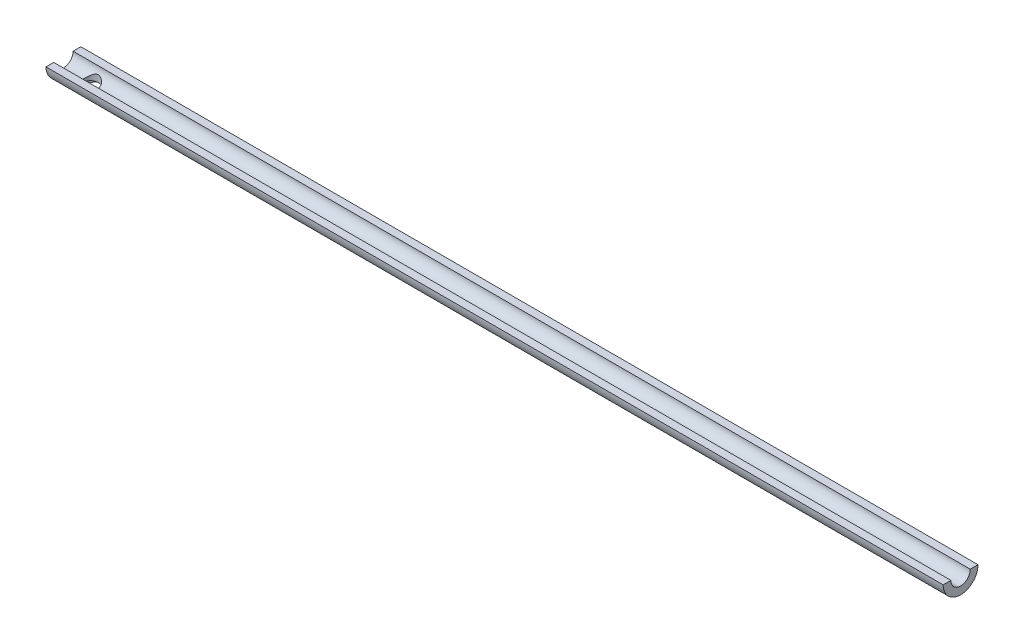
ISO-10303-21;
HEADER;
FILE_DESCRIPTION(('STEP AP214'),'2;1');
FILE_NAME('part.step','',(''),(''),'','','');
FILE_SCHEMA(('AUTOMOTIVE_DESIGN { 1 0 10303 214 1 1 1 1 }'));
ENDSEC;
DATA;
#1=APPLICATION_CONTEXT('core data for automotive mechanical design processes');
#2=APPLICATION_PROTOCOL_DEFINITION('international standard','automotive_design',2000,#1);
#3=PRODUCT_CONTEXT('',#1,'mechanical');
#4=PRODUCT('Part','Part','',(#3));
#5=PRODUCT_RELATED_PRODUCT_CATEGORY('part','',(#4));
#6=PRODUCT_DEFINITION_FORMATION('','',#4);
#7=PRODUCT_DEFINITION_CONTEXT('part definition',#1,'design');
#8=PRODUCT_DEFINITION('design','',#6,#7);
#9=PRODUCT_DEFINITION_SHAPE('','',#8);
#10=(LENGTH_UNIT() NAMED_UNIT(*) SI_UNIT(.MILLI.,.METRE.));
#11=(NAMED_UNIT(*) PLANE_ANGLE_UNIT() SI_UNIT($,.RADIAN.));
#12=(NAMED_UNIT(*) SI_UNIT($,.STERADIAN.) SOLID_ANGLE_UNIT());
#13=UNCERTAINTY_MEASURE_WITH_UNIT(LENGTH_MEASURE(1.E-05),#10,'distance_accuracy_value','');
#14=(GEOMETRIC_REPRESENTATION_CONTEXT(3) GLOBAL_UNCERTAINTY_ASSIGNED_CONTEXT((#13)) GLOBAL_UNIT_ASSIGNED_CONTEXT((#10,
#11,#12)) REPRESENTATION_CONTEXT('',''));
#15=CARTESIAN_POINT('',(0.,0.,0.));
#16=DIRECTION('',(0.,0.,1.));
#17=DIRECTION('',(1.,0.,0.));
#18=AXIS2_PLACEMENT_3D('',#15,#16,#17);
#19=CARTESIAN_POINT('',(735.584,15.875,0.));
#20=DIRECTION('',(-1.,0.,0.));
#21=DIRECTION('',(0.,0.,1.));
#22=AXIS2_PLACEMENT_3D('',#19,#20,#21);
#23=PLANE('',#22);
#24=CARTESIAN_POINT('',(735.584,15.875,-19.05));
#25=DIRECTION('',(-1.,0.,0.));
#26=DIRECTION('',(0.,0.,1.));
#27=AXIS2_PLACEMENT_3D('',#24,#25,#26);
#28=CIRCLE('',#27,14.2875);
#29=CARTESIAN_POINT('',(735.584,15.875,-33.3375));
#30=VERTEX_POINT('',#29);
#31=CARTESIAN_POINT('',(735.584,15.875,-4.7625));
#32=VERTEX_POINT('',#31);
#33=EDGE_CURVE('E65',#30,#32,#28,.T.);
#34=ORIENTED_EDGE('',*,*,#33,.F.);
#35=DIRECTION('',(0.,0.,-1.));
#36=VECTOR('',#35,1.);
#37=CARTESIAN_POINT('',(735.584,15.875,0.));
#38=LINE('',#37,#36);
#39=CARTESIAN_POINT('',(735.584,15.875,-26.9875));
#40=VERTEX_POINT('',#39);
#41=EDGE_CURVE('E105',#40,#30,#38,.T.);
#42=ORIENTED_EDGE('',*,*,#41,.F.);
#43=CARTESIAN_POINT('',(735.584,15.875,-19.05));
#44=DIRECTION('',(1.,0.,0.));
#45=DIRECTION('',(0.,0.,-1.));
#46=AXIS2_PLACEMENT_3D('',#43,#44,#45);
#47=CIRCLE('',#46,7.9375);
#48=CARTESIAN_POINT('',(735.584,15.875,-11.1125));
#49=VERTEX_POINT('',#48);
#50=EDGE_CURVE('E119',#49,#40,#47,.T.);
#51=ORIENTED_EDGE('',*,*,#50,.F.);
#52=EDGE_CURVE('E101',#32,#49,#38,.T.);
#53=ORIENTED_EDGE('',*,*,#52,.F.);
#54=EDGE_LOOP('',(#34,#42,#51,#53));
#55=FACE_BOUND('',#54,.T.);
#56=ADVANCED_FACE('F37',(#55),#23,.F.);
#57=CARTESIAN_POINT('',(0.,15.875,0.));
#58=DIRECTION('',(0.,-1.,0.));
#59=DIRECTION('',(0.,0.,-1.));
#60=AXIS2_PLACEMENT_3D('',#57,#58,#59);
#61=PLANE('',#60);
#62=DIRECTION('',(-1.,0.,0.));
#63=VECTOR('',#62,1.);
#64=CARTESIAN_POINT('',(735.584,15.875,-33.3375));
#65=LINE('',#64,#63);
#66=CARTESIAN_POINT('',(0.,15.875,-33.3375));
#67=VERTEX_POINT('',#66);
#68=EDGE_CURVE('E88',#67,#30,#65,.F.);
#69=ORIENTED_EDGE('',*,*,#68,.F.);
#70=DIRECTION('',(0.,0.,1.));
#71=VECTOR('',#70,1.);
#72=CARTESIAN_POINT('',(0.,15.875,0.));
#73=LINE('',#72,#71);
#74=CARTESIAN_POINT('',(0.,15.875,-26.9875));
#75=VERTEX_POINT('',#74);
#76=EDGE_CURVE('E106',#67,#75,#73,.T.);
#77=ORIENTED_EDGE('',*,*,#76,.T.);
#78=DIRECTION('',(1.,0.,0.));
#79=VECTOR('',#78,1.);
#80=CARTESIAN_POINT('',(0.,15.875,-26.9875));
#81=LINE('',#80,#79);
#82=EDGE_CURVE('E12',#75,#40,#81,.T.);
#83=ORIENTED_EDGE('',*,*,#82,.T.);
#84=ORIENTED_EDGE('',*,*,#41,.T.);
#85=EDGE_LOOP('',(#69,#77,#83,#84));
#86=FACE_BOUND('',#85,.T.);
#87=ADVANCED_FACE('F102',(#86),#61,.F.);
#88=DIRECTION('',(-1.,0.,0.));
#89=VECTOR('',#88,1.);
#90=CARTESIAN_POINT('',(735.584,15.875,-4.7625));
#91=LINE('',#90,#89);
#92=CARTESIAN_POINT('',(0.,15.875,-4.7625));
#93=VERTEX_POINT('',#92);
#94=EDGE_CURVE('E98',#32,#93,#91,.T.);
#95=ORIENTED_EDGE('',*,*,#94,.F.);
#96=ORIENTED_EDGE('',*,*,#52,.T.);
#97=DIRECTION('',(1.,0.,0.));
#98=VECTOR('',#97,1.);
#99=CARTESIAN_POINT('',(0.,15.875,-11.1125));
#100=LINE('',#99,#98);
#101=CARTESIAN_POINT('',(0.,15.875,-11.1125));
#102=VERTEX_POINT('',#101);
#103=EDGE_CURVE('E53',#49,#102,#100,.F.);
#104=ORIENTED_EDGE('',*,*,#103,.T.);
#105=EDGE_CURVE('E108',#102,#93,#73,.T.);
#106=ORIENTED_EDGE('',*,*,#105,.T.);
#107=EDGE_LOOP('',(#95,#96,#104,#106));
#108=FACE_BOUND('',#107,.T.);
#109=ADVANCED_FACE('F133',(#108),#61,.F.);
#110=CARTESIAN_POINT('',(22.225,5.5499,-19.05));
#111=DIRECTION('',(0.,-1.,0.));
#112=DIRECTION('',(0.,0.,-1.));
#113=AXIS2_PLACEMENT_3D('',#110,#111,#112);
#114=CYLINDRICAL_SURFACE('',#113,8.128);
#115=CARTESIAN_POINT('',(22.225,5.5499,-19.05));
#116=DIRECTION('',(0.,-1.,0.));
#117=DIRECTION('',(0.,0.,-1.));
#118=AXIS2_PLACEMENT_3D('',#115,#116,#117);
#119=CIRCLE('',#118,8.128);
#120=CARTESIAN_POINT('',(22.225,5.5499,-27.178));
#121=VERTEX_POINT('',#120);
#122=EDGE_CURVE('E94',#121,#121,#119,.T.);
#123=ORIENTED_EDGE('',*,*,#122,.F.);
#124=EDGE_LOOP('',(#123));
#125=FACE_BOUND('',#124,.T.);
#126=CARTESIAN_POINT('',(22.225,4.12475437490772,-27.178));
#127=CARTESIAN_POINT('',(22.0180147532059,4.1247532803757,-27.1779992237774));
#128=CARTESIAN_POINT('',(21.8110182894372,4.11926483692695,-27.1700813911082));
#129=CARTESIAN_POINT('',(21.3987922198779,4.09754245588704,-27.1385418085654));
#130=CARTESIAN_POINT('',(21.1935627571081,4.08130765661839,-27.1149187993993));
#131=CARTESIAN_POINT('',(20.7863878615931,4.03874877782049,-27.0523271400779));
#132=CARTESIAN_POINT('',(20.5844447959058,4.01241773491488,-27.0133478982228));
#133=CARTESIAN_POINT('',(20.1853282556612,3.95067075075943,-26.920586092574));
#134=CARTESIAN_POINT('',(19.988157024114,3.91525062456957,-26.8667967088247));
#135=CARTESIAN_POINT('',(19.6012008031054,3.83685509724765,-26.745511165725));
#136=CARTESIAN_POINT('',(19.4113740403267,3.79393385173565,-26.6781127509178));
#137=CARTESIAN_POINT('',(19.0385167877705,3.7016974888775,-26.5300382259267));
#138=CARTESIAN_POINT('',(18.8554888516306,3.6523799997255,-26.4493571873782));
#139=CARTESIAN_POINT('',(18.4970035159903,3.54873604210493,-26.2753794395942));
#140=CARTESIAN_POINT('',(18.3215461204565,3.49440957101198,-26.1820827237488));
#141=CARTESIAN_POINT('',(17.9788353795059,3.38212322601149,-25.9835226420731));
#142=CARTESIAN_POINT('',(17.8115823141774,3.32416322821229,-25.8782588681046));
#143=CARTESIAN_POINT('',(17.2873582640215,3.13391765196363,-25.5210848460265));
#144=CARTESIAN_POINT('',(16.946984312011,2.99695023811273,-25.2464934731679));
#145=CARTESIAN_POINT('',(16.472669066792,2.79305720220681,-24.7965425661813));
#146=CARTESIAN_POINT('',(16.3205174293569,2.72530880154062,-24.6401003216129));
#147=CARTESIAN_POINT('',(16.0288266458558,2.59177681487287,-24.3149290275969));
#148=CARTESIAN_POINT('',(15.8892896853653,2.52599357066447,-24.1461978581212));
#149=CARTESIAN_POINT('',(15.6112113719546,2.39188965528202,-23.7807265060997));
#150=CARTESIAN_POINT('',(15.4740014746693,2.32391350337649,-23.5828450606214));
#151=CARTESIAN_POINT('',(15.2169626423935,2.19404365322446,-23.1743177307861));
#152=CARTESIAN_POINT('',(15.0971260526265,2.13214728009375,-22.963677526368));
#153=CARTESIAN_POINT('',(14.8760572788859,2.01619860561373,-22.5308687873104));
#154=CARTESIAN_POINT('',(14.7748183059184,1.96214344338009,-22.3087044976281));
#155=CARTESIAN_POINT('',(14.592178921927,1.86349332974293,-21.8543445193544));
#156=CARTESIAN_POINT('',(14.5107756478608,1.81889701319039,-21.6221502841663));
#157=CARTESIAN_POINT('',(14.375223971502,1.74402848766091,-21.170385845118));
#158=CARTESIAN_POINT('',(14.3193106352917,1.71284266792939,-20.9514960729174));
#159=CARTESIAN_POINT('',(14.2257583035214,1.66040767567717,-20.5086681999183));
#160=CARTESIAN_POINT('',(14.1881183305758,1.63915797170662,-20.2847303697953));
#161=CARTESIAN_POINT('',(14.1317025233993,1.60723228622229,-19.8338970737274));
#162=CARTESIAN_POINT('',(14.1129137486965,1.59654905138997,-19.6070037451223));
#163=CARTESIAN_POINT('',(14.0944574588793,1.58605556350154,-19.152197221018));
#164=CARTESIAN_POINT('',(14.0947882780549,1.58624436326758,-18.9242841160921));
#165=CARTESIAN_POINT('',(14.1134480106352,1.59685216207865,-18.4950597861182));
#166=CARTESIAN_POINT('',(14.1297567730494,1.60612288849519,-18.2936283829412));
#167=CARTESIAN_POINT('',(14.1772302026522,1.63300272114614,-17.8930847861401));
#168=CARTESIAN_POINT('',(14.2083948904262,1.6506118389348,-17.6939725957299));
#169=CARTESIAN_POINT('',(14.285205100033,1.6937586086349,-17.2994481376163));
#170=CARTESIAN_POINT('',(14.330850422873,1.71929615159389,-17.1040358191084));
#171=CARTESIAN_POINT('',(14.4361090438978,1.77772437070963,-16.7181404779157));
#172=CARTESIAN_POINT('',(14.4957228984782,1.81061533976627,-16.5276576519185));
#173=CARTESIAN_POINT('',(14.6289037163109,1.883366444814,-16.151044574491));
#174=CARTESIAN_POINT('',(14.7025895729946,1.92328572021973,-15.9649678088723));
#175=CARTESIAN_POINT('',(14.8628859216692,2.00905516258062,-15.5998607105857));
#176=CARTESIAN_POINT('',(14.9495007436819,2.05490731581992,-15.420832764111));
#177=CARTESIAN_POINT('',(15.2276890928379,2.20000547802107,-14.8956302559676));
#178=CARTESIAN_POINT('',(15.4376919804277,2.30684115966405,-14.5610979019035));
#179=CARTESIAN_POINT('',(15.9273094610793,2.54539424455193,-13.8930550781077));
#180=CARTESIAN_POINT('',(16.2120962339968,2.67855865345796,-13.5638891046657));
#181=CARTESIAN_POINT('',(16.8300430009505,2.94841747384691,-12.9551675557189));
#182=CARTESIAN_POINT('',(17.1632609297996,3.08511594956813,-12.6756723006394));
#183=CARTESIAN_POINT('',(17.7123785400368,3.28931712151679,-12.285552451061));
#184=CARTESIAN_POINT('',(17.9135239179696,3.3602555712769,-12.1555659656631));
#185=CARTESIAN_POINT('',(18.3279364553059,3.49690988125253,-11.9131328407156));
#186=CARTESIAN_POINT('',(18.5412052632069,3.56262502829579,-11.8006885943137));
#187=CARTESIAN_POINT('',(18.9784190779849,3.68628936956866,-11.5946376821911));
#188=CARTESIAN_POINT('',(19.2023480558645,3.74424975339225,-11.5010037743509));
#189=CARTESIAN_POINT('',(19.6597889977331,3.85006144936678,-11.3335671871596));
#190=CARTESIAN_POINT('',(19.8932976168246,3.89791625477487,-11.2597576525893));
#191=CARTESIAN_POINT('',(20.3141247550129,3.97176227899168,-11.147531505603));
#192=CARTESIAN_POINT('',(20.4998869661831,4.00025064127314,-11.1048837500096));
#193=CARTESIAN_POINT('',(20.8749901106291,4.04891667287766,-11.032624119537));
#194=CARTESIAN_POINT('',(21.0643303425699,4.06909595356551,-11.0030097170471));
#195=CARTESIAN_POINT('',(21.4452238519753,4.10043715333412,-10.9572193397773));
#196=CARTESIAN_POINT('',(21.6367752842204,4.11160610746744,-10.9410328804927));
#197=CARTESIAN_POINT('',(22.0208703931804,4.12454872876364,-10.922289176426));
#198=CARTESIAN_POINT('',(22.2134140953366,4.12632215381884,-10.9197322828558));
#199=CARTESIAN_POINT('',(22.5981461721252,4.12040541837536,-10.9282890627355));
#200=CARTESIAN_POINT('',(22.7903343200902,4.11271051065841,-10.9394095937503));
#201=CARTESIAN_POINT('',(23.1728480072731,4.08813218458613,-10.9751705709717));
#202=CARTESIAN_POINT('',(23.3631735398583,4.0712487335235,-10.9998110653035));
#203=CARTESIAN_POINT('',(23.7407450063913,4.02888080940674,-11.062288437456));
#204=CARTESIAN_POINT('',(23.9279896141035,4.00339272894072,-11.1001308502822));
#205=CARTESIAN_POINT('',(24.2982642769525,3.94464973717565,-11.1885617223697));
#206=CARTESIAN_POINT('',(24.4812926013519,3.91139169667847,-11.2391553175666));
#207=CARTESIAN_POINT('',(24.844494847235,3.83764193152166,-11.3532904310791));
#208=CARTESIAN_POINT('',(25.0246000490354,3.79706122163712,-11.4169927594608));
#209=CARTESIAN_POINT('',(25.3787080656639,3.71010547664289,-11.5563533307756));
#210=CARTESIAN_POINT('',(25.5527088431555,3.6637285301769,-11.6320155197594));
#211=CARTESIAN_POINT('',(26.0645284851636,3.51767962655346,-11.8760720749144));
#212=CARTESIAN_POINT('',(26.3923325093595,3.41105365305769,-12.061589808659));
#213=CARTESIAN_POINT('',(27.0686900250849,3.17013197155076,-12.508338747979));
#214=CARTESIAN_POINT('',(27.4117498844501,3.03417303350307,-12.7770107658701));
#215=CARTESIAN_POINT('',(27.8909516798366,2.83082797521136,-13.2183070688705));
#216=CARTESIAN_POINT('',(28.0448883261136,2.76309531190179,-13.3719150091513));
#217=CARTESIAN_POINT('',(28.3403524753679,2.6293049873683,-13.6914386250406));
#218=CARTESIAN_POINT('',(28.4818779387584,2.56324760271373,-13.8573563153278));
#219=CARTESIAN_POINT('',(28.7648784244889,2.42801685551445,-14.2176239858584));
#220=CARTESIAN_POINT('',(28.9049937562794,2.35917096368468,-14.4131675097714));
#221=CARTESIAN_POINT('',(29.1680510426809,2.22724240655099,-14.8172109410428));
#222=CARTESIAN_POINT('',(29.2910003725608,2.16415727022872,-15.0257052282056));
#223=CARTESIAN_POINT('',(29.5185153802836,2.04553079179035,-15.4544625311531));
#224=CARTESIAN_POINT('',(29.623087585257,1.9899867728441,-15.6747213320632));
#225=CARTESIAN_POINT('',(29.8126114017301,1.88808715215838,-16.1255674144062));
#226=CARTESIAN_POINT('',(29.8975657204929,1.84173028272008,-16.356153265459));
#227=CARTESIAN_POINT('',(30.0405319279167,1.76303511449334,-16.8065627144205));
#228=CARTESIAN_POINT('',(30.1001807373834,1.72985955165364,-17.0257206954869));
#229=CARTESIAN_POINT('',(30.2010980032451,1.6734276457378,-17.4694910599292));
#230=CARTESIAN_POINT('',(30.2423673439576,1.65017082542945,-17.694103180334));
#231=CARTESIAN_POINT('',(30.3058771817978,1.61427905051082,-18.1466803103593));
#232=CARTESIAN_POINT('',(30.328131386229,1.6016364446235,-18.3746427840472));
#233=CARTESIAN_POINT('',(30.3533008556728,1.58733273321917,-18.8319685103891));
#234=CARTESIAN_POINT('',(30.3562179535954,1.58567058689532,-19.0613316282171));
#235=CARTESIAN_POINT('',(30.3434555646966,1.59292805827617,-19.4929113254883));
#236=CARTESIAN_POINT('',(30.329877594262,1.6006519084853,-19.6952143027216));
#237=CARTESIAN_POINT('',(30.2877260874705,1.62454313495614,-20.0977497224463));
#238=CARTESIAN_POINT('',(30.259152613769,1.64071047593858,-20.2979821735855));
#239=CARTESIAN_POINT('',(30.1873597538179,1.6811081377679,-20.6949623606104));
#240=CARTESIAN_POINT('',(30.1441407301919,1.70533825898019,-20.8917101826484));
#241=CARTESIAN_POINT('',(30.0435525296171,1.76130836593261,-21.2804571592908));
#242=CARTESIAN_POINT('',(29.9861828292883,1.79304862944265,-21.4724561379644));
#243=CARTESIAN_POINT('',(29.8577103118146,1.86344616022037,-21.8511049285758));
#244=CARTESIAN_POINT('',(29.7865700609654,1.90212226021264,-22.0377385298514));
#245=CARTESIAN_POINT('',(29.6313250934355,1.9855200799614,-22.4041579276078));
#246=CARTESIAN_POINT('',(29.547216049953,2.03024381678706,-22.5839414136153));
#247=CARTESIAN_POINT('',(29.2764762262614,2.17215934525449,-23.1116732419864));
#248=CARTESIAN_POINT('',(29.0713476266087,2.27714337546833,-23.448251074376));
#249=CARTESIAN_POINT('',(28.5924271313372,2.51221039405393,-24.1204134915682));
#250=CARTESIAN_POINT('',(28.3135686743286,2.64378358838054,-24.4518300479086));
#251=CARTESIAN_POINT('',(27.7075374404192,2.91149202465902,-25.066008590855));
#252=CARTESIAN_POINT('',(27.380307034293,3.04763255637928,-25.3487116591085));
#253=CARTESIAN_POINT('',(26.8397096345114,3.25231241551686,-25.7452001411438));
#254=CARTESIAN_POINT('',(26.6410517451605,3.32379995190781,-25.8779005695173));
#255=CARTESIAN_POINT('',(26.2314938118909,3.46197839661398,-26.1259932134789));
#256=CARTESIAN_POINT('',(26.0205920153576,3.52866861515832,-26.2413829426684));
#257=CARTESIAN_POINT('',(25.5879373800307,3.65473552688157,-26.4535817018082));
#258=CARTESIAN_POINT('',(25.3662003977546,3.71412248496211,-26.5504169199846));
#259=CARTESIAN_POINT('',(24.9129075625092,3.82324468480013,-26.7245307380687));
#260=CARTESIAN_POINT('',(24.6813552048321,3.87298332775522,-26.801816232523));
#261=CARTESIAN_POINT('',(24.2671813550624,3.9499023117823,-26.9194578131634));
#262=CARTESIAN_POINT('',(24.0862738513112,3.97962899667628,-26.9642247084879));
#263=CARTESIAN_POINT('',(23.7207562828793,4.03131583410353,-27.0413681658742));
#264=CARTESIAN_POINT('',(23.5361469383456,4.05327748203223,-27.073747113713));
#265=CARTESIAN_POINT('',(23.164458579354,4.08870874786635,-27.1257035236378));
#266=CARTESIAN_POINT('',(22.9773814513257,4.10218450749925,-27.1452902445796));
#267=CARTESIAN_POINT('',(22.6018727277906,4.1202082191966,-27.1714394195515));
#268=CARTESIAN_POINT('',(22.4134410124486,4.12475537137837,-27.1780007066792));
#269=CARTESIAN_POINT('',(22.225,4.12475437490772,-27.178));
#270=B_SPLINE_CURVE_WITH_KNOTS('',3,(#126,#127,#128,#129,#130,#131,#132,#133,#134,#135,#136,
#137,#138,#139,#140,#141,#142,#143,#144,#145,#146,#147,#148,#149,#150,#151,#152,#153,#154,#155,
#156,#157,#158,#159,#160,#161,#162,#163,#164,#165,#166,#167,#168,#169,#170,#171,#172,#173,#174,
#175,#176,#177,#178,#179,#180,#181,#182,#183,#184,#185,#186,#187,#188,#189,#190,#191,#192,#193,
#194,#195,#196,#197,#198,#199,#200,#201,#202,#203,#204,#205,#206,#207,#208,#209,#210,#211,#212,
#213,#214,#215,#216,#217,#218,#219,#220,#221,#222,#223,#224,#225,#226,#227,#228,#229,#230,#231,
#232,#233,#234,#235,#236,#237,#238,#239,#240,#241,#242,#243,#244,#245,#246,#247,#248,#249,#250,
#251,#252,#253,#254,#255,#256,#257,#258,#259,#260,#261,#262,#263,#264,#265,#266,#267,#268,#269),
.UNSPECIFIED.,.T.,.F.,(4,2,2,2,2,2,2,2,2,2,2,2,2,2,2,2,2,2,2,2,2,2,2,2,2,2,2,2,2,2,2,2,2,2,2,2,
2,2,2,2,2,2,2,2,2,2,2,2,2,2,2,2,2,2,2,2,2,2,2,2,2,2,2,2,2,2,2,2,2,2,2,4),(0.,0.620754127397335,
1.24155803489433,1.86279088308009,2.48431028401051,3.10151510056483,3.71894944213898,
4.33638410720971,4.95383983629194,6.32207699198678,7.0070909176564,7.69222329994257,
8.44188180863365,9.19120900314588,9.94026211248618,10.6892070409743,11.3724245891144,
12.0556055900344,12.7383172974124,13.4209695266473,14.0271565984417,14.6333445102122,
15.2395240921138,15.8457278235166,16.457300101753,17.069077662278,18.2918655983163,
19.6521467844397,21.0140687809612,21.7625974992275,22.5112282441642,23.2587668400916,
24.0060466052428,24.5835815681624,25.161004477988,25.737976111966,26.3149626135041,
26.8922385215696,27.4695164845053,28.0470367670997,28.624790036755,29.2101056428332,
29.7956147733005,30.9660989876605,32.329617069885,33.0123866851701,33.6952682936899,
34.4449625332793,35.1943336735009,35.943438114087,36.6924391166014,37.3800868041914,
38.0677014024412,38.7548199057505,39.4418732780968,40.0498584890229,40.6578411596363,
41.2658087777079,41.8737988855684,42.4834655652482,43.0933360910135,44.3122855860784,
45.6650948400749,47.0195289870142,47.7668485354288,48.5142753215082,49.2606392749048,
50.0067396420717,50.5723472476314,51.1378458687382,51.7029347339975,52.2680742212807),.UNSPECIFIED.);
#271=CARTESIAN_POINT('',(22.225,4.12475437490772,-27.178));
#272=VERTEX_POINT('',#271);
#273=EDGE_CURVE('E42',#272,#272,#270,.T.);
#274=ORIENTED_EDGE('',*,*,#273,.F.);
#275=EDGE_LOOP('',(#274));
#276=FACE_BOUND('',#275,.T.);
#277=ADVANCED_FACE('F129',(#125,#276),#114,.F.);
#278=CARTESIAN_POINT('',(22.225,15.875,-19.05));
#279=DIRECTION('',(0.,-1.,0.));
#280=DIRECTION('',(0.,0.,-1.));
#281=AXIS2_PLACEMENT_3D('',#278,#279,#280);
#282=CYLINDRICAL_SURFACE('',#281,6.35);
#283=CARTESIAN_POINT('',(22.225,11.1125,-25.4));
#284=CARTESIAN_POINT('',(22.1057591384843,11.1124972219549,-25.3999988458941));
#285=CARTESIAN_POINT('',(21.9864748221275,11.1079993597814,-25.3966322226424));
#286=CARTESIAN_POINT('',(21.7488907056395,11.0902297345786,-25.3832454421482));
#287=CARTESIAN_POINT('',(21.6305916325855,11.0769519886551,-25.373220747862));
#288=CARTESIAN_POINT('',(21.3956326538325,11.0422244649837,-25.3467183488856));
#289=CARTESIAN_POINT('',(21.2789776740302,11.0207540188557,-25.3302243205294));
#290=CARTESIAN_POINT('',(21.0482322748224,10.9705645850597,-25.2911079734667));
#291=CARTESIAN_POINT('',(20.9341436187361,10.9418407698869,-25.2684815726006));
#292=CARTESIAN_POINT('',(20.6698149950906,10.8671250091594,-25.2085803850203));
#293=CARTESIAN_POINT('',(20.5208230817188,10.8186030878779,-25.1689484172837));
#294=CARTESIAN_POINT('',(20.2289745443959,10.7129272316712,-25.0800639867922));
#295=CARTESIAN_POINT('',(20.0861181200141,10.6557730162358,-25.0308112113897));
#296=CARTESIAN_POINT('',(19.8062660642576,10.5349899459523,-24.9232234692227));
#297=CARTESIAN_POINT('',(19.669285792068,10.4713454366179,-24.8648663544885));
#298=CARTESIAN_POINT('',(19.4015035032551,10.3396631652094,-24.7396585029541));
#299=CARTESIAN_POINT('',(19.2707013299446,10.2716255146565,-24.67280798172));
#300=CARTESIAN_POINT('',(18.9689123311058,10.1076666116393,-24.5052741617836));
#301=CARTESIAN_POINT('',(18.8004994083019,10.0105595449506,-24.4010983926801));
#302=CARTESIAN_POINT('',(18.4747411758871,9.81455900031779,-24.1780631831489));
#303=CARTESIAN_POINT('',(18.3173998706645,9.71566489212355,-24.0591984724233));
#304=CARTESIAN_POINT('',(18.0141745830674,9.51896622305511,-23.8071297364857));
#305=CARTESIAN_POINT('',(17.8682815003554,9.42116085091244,-23.6739373044144));
#306=CARTESIAN_POINT('',(17.5884520150845,9.22905033185359,-23.3932895774403));
#307=CARTESIAN_POINT('',(17.4545116369805,9.13474402726844,-23.2458390591218));
#308=CARTESIAN_POINT('',(17.2247252749737,8.9699959351478,-22.9673449195798));
#309=CARTESIAN_POINT('',(17.1265784648234,8.8985179083313,-22.838807636718));
#310=CARTESIAN_POINT('',(16.9392996888609,8.76050584730411,-22.5728278495661));
#311=CARTESIAN_POINT('',(16.8501659790643,8.69397085730703,-22.435387076528));
#312=CARTESIAN_POINT('',(16.6818224419905,8.5671160758903,-22.1520641335981));
#313=CARTESIAN_POINT('',(16.6026009502199,8.50678899426989,-22.0061921867114));
#314=CARTESIAN_POINT('',(16.4548972991769,8.39347292260139,-21.7063744157807));
#315=CARTESIAN_POINT('',(16.3864133583647,8.34048271541368,-21.5524299367735));
#316=CARTESIAN_POINT('',(16.2712998867497,8.25090222497836,-21.2627288912534));
#317=CARTESIAN_POINT('',(16.2229271245307,8.21304556414684,-21.1280548308056));
#318=CARTESIAN_POINT('',(16.1350073540434,8.1439796234637,-20.8542062924032));
#319=CARTESIAN_POINT('',(16.0954586643362,8.11276907723781,-20.7150326776414));
#320=CARTESIAN_POINT('',(16.0257319046027,8.05759142155982,-20.4329925890225));
#321=CARTESIAN_POINT('',(15.9955506797095,8.03362187348591,-20.2901273760563));
#322=CARTESIAN_POINT('',(15.9449979075001,7.99340132029282,-20.0015900671859));
#323=CARTESIAN_POINT('',(15.9246264773177,7.97715040733795,-19.8559179377874));
#324=CARTESIAN_POINT('',(15.8939742252697,7.95267660979672,-19.5623202973743));
#325=CARTESIAN_POINT('',(15.8837290807651,7.94448211044445,-19.4143886706816));
#326=CARTESIAN_POINT('',(15.8736317234484,7.93640591835768,-19.1179425051374));
#327=CARTESIAN_POINT('',(15.8737795306279,7.93652424161364,-18.9694279651653));
#328=CARTESIAN_POINT('',(15.8844657647045,7.94507122345287,-18.6730105441203));
#329=CARTESIAN_POINT('',(15.8950045434275,7.95350016342383,-18.5251076839286));
#330=CARTESIAN_POINT('',(15.9262904810444,7.97847801465032,-18.2310877763495));
#331=CARTESIAN_POINT('',(15.9470374044877,7.99502673862313,-18.0849706878529));
#332=CARTESIAN_POINT('',(15.9969907893957,8.03476476708318,-17.8035288449841));
#333=CARTESIAN_POINT('',(16.0256710532915,8.05754022627937,-17.6680516176092));
#334=CARTESIAN_POINT('',(16.0914535840831,8.10960253530147,-17.400416540722));
#335=CARTESIAN_POINT('',(16.1285587103399,8.1388915957453,-17.2682598351326));
#336=CARTESIAN_POINT('',(16.2518278800462,8.23578674342528,-16.8778934421997));
#337=CARTESIAN_POINT('',(16.3499812030746,8.31244938670406,-16.6255922490497));
#338=CARTESIAN_POINT('',(16.5849425790291,8.49357006379646,-16.1177567955594));
#339=CARTESIAN_POINT('',(16.7245634348964,8.59999424128749,-15.8642523230182));
#340=CARTESIAN_POINT('',(17.0323997031645,8.82985693419508,-15.3838163607941));
#341=CARTESIAN_POINT('',(17.2006311227357,8.9533049668444,-15.1568998673721));
#342=CARTESIAN_POINT('',(17.599247533671,9.23757648369878,-14.6866782205678));
#343=CARTESIAN_POINT('',(17.8352964950782,9.40085954638908,-14.4496328536501));
#344=CARTESIAN_POINT('',(18.2134644245732,9.64885681800549,-14.1247852202108));
#345=CARTESIAN_POINT('',(18.3436715236388,9.73211536165979,-14.0215391926606));
#346=CARTESIAN_POINT('',(18.6120364616535,9.89806459791115,-13.8253838447953));
#347=CARTESIAN_POINT('',(18.750193345466,9.98075535739463,-13.7324732866306));
#348=CARTESIAN_POINT('',(19.0207172231311,10.1358559433147,-13.5656739544279));
#349=CARTESIAN_POINT('',(19.1523596374472,10.2084887250832,-13.4908149565788));
#350=CARTESIAN_POINT('',(19.4222204839244,10.3501671307733,-13.3499914110003));
#351=CARTESIAN_POINT('',(19.5604396658711,10.4192123438073,-13.284027880703));
#352=CARTESIAN_POINT('',(19.8433344682341,10.5516401770166,-13.1615478674818));
#353=CARTESIAN_POINT('',(19.9879986018397,10.6150323113207,-13.1050153669272));
#354=CARTESIAN_POINT('',(20.2838916089167,10.7338991642908,-13.0019283687376));
#355=CARTESIAN_POINT('',(20.4351174417561,10.7893775001025,-12.9553693076468));
#356=CARTESIAN_POINT('',(20.8050750302486,10.909488067719,-12.856790901728));
#357=CARTESIAN_POINT('',(21.0269350008432,10.9691190991629,-12.8098438723878));
#358=CARTESIAN_POINT('',(21.3664756142304,11.0370120991732,-12.7572595239636));
#359=CARTESIAN_POINT('',(21.4807187070347,11.0560464606787,-12.7427070978371));
#360=CARTESIAN_POINT('',(21.7108427999921,11.0861810382376,-12.7197958167764));
#361=CARTESIAN_POINT('',(21.8267229997876,11.0972850031914,-12.7114340352982));
#362=CARTESIAN_POINT('',(22.0599834113241,11.1110734118982,-12.7010642058163));
#363=CARTESIAN_POINT('',(22.1773684632081,11.1137058814102,-12.6990953791486));
#364=CARTESIAN_POINT('',(22.4119367053587,11.1102754878997,-12.701668656824));
#365=CARTESIAN_POINT('',(22.5291198988202,11.1042127637899,-12.7062106571513));
#366=CARTESIAN_POINT('',(22.7624286286122,11.0836834457076,-12.7217020603789));
#367=CARTESIAN_POINT('',(22.8785529846686,11.0692084186486,-12.7326578930387));
#368=CARTESIAN_POINT('',(23.1088555865426,11.0325145270898,-12.7607416573147));
#369=CARTESIAN_POINT('',(23.2230327388028,11.0102914523313,-12.777872944821));
#370=CARTESIAN_POINT('',(23.4774218722534,10.9525028875428,-12.823075168888));
#371=CARTESIAN_POINT('',(23.6168924813598,10.9149829450432,-12.8528186884582));
#372=CARTESIAN_POINT('',(23.891099520446,10.8311707927761,-12.9208402097144));
#373=CARTESIAN_POINT('',(24.0258319605229,10.7848713902393,-12.9591252137757));
#374=CARTESIAN_POINT('',(24.2904860170597,10.6853406939884,-13.0437021656338));
#375=CARTESIAN_POINT('',(24.4203954892771,10.632093249229,-13.0900128544685));
#376=CARTESIAN_POINT('',(24.6749685412999,10.5204998989995,-13.1900635829332));
#377=CARTESIAN_POINT('',(24.7996336408536,10.4621554858521,-13.2438014506513));
#378=CARTESIAN_POINT('',(25.0997979426272,10.31426122627,-13.384602120324));
#379=CARTESIAN_POINT('',(25.2724245021782,10.2226593973931,-13.4756543649093));
#380=CARTESIAN_POINT('',(25.6070500128911,10.035440516892,-13.6720921009435));
#381=CARTESIAN_POINT('',(25.7690445595234,9.93982182776937,-13.7774834778029));
#382=CARTESIAN_POINT('',(26.0825519969922,9.74745639829163,-14.0023242549401));
#383=CARTESIAN_POINT('',(26.2340543941688,9.6507086385288,-14.1217874155795));
#384=CARTESIAN_POINT('',(26.5260896306543,9.45871705837796,-14.3744890206292));
#385=CARTESIAN_POINT('',(26.6666241816978,9.36347300516712,-14.5077253079136));
#386=CARTESIAN_POINT('',(26.9380504997915,9.1754069890604,-14.7898921125293));
#387=CARTESIAN_POINT('',(27.0687750671124,9.08263935328997,-14.9390203072271));
#388=CARTESIAN_POINT('',(27.3172922119868,8.90323851781723,-15.2512030194205));
#389=CARTESIAN_POINT('',(27.4350827656831,8.81660627890547,-15.4142597093085));
#390=CARTESIAN_POINT('',(27.6560024910763,8.65199601724719,-15.753402670861));
#391=CARTESIAN_POINT('',(27.759171059199,8.57399486899366,-15.9294519094453));
#392=CARTESIAN_POINT('',(27.9495041145189,8.42868701323317,-16.2941347802323));
#393=CARTESIAN_POINT('',(28.0366776630869,8.36137425355324,-16.4827612042111));
#394=CARTESIAN_POINT('',(28.1679371759395,8.25930533821191,-16.8085411976495));
#395=CARTESIAN_POINT('',(28.2168523605264,8.22105056904939,-16.9426768003211));
#396=CARTESIAN_POINT('',(28.3059225755803,8.1511238480204,-17.2154828490856));
#397=CARTESIAN_POINT('',(28.3460798872378,8.11945018205531,-17.3541521034368));
#398=CARTESIAN_POINT('',(28.4170802762044,8.06329128564868,-17.6352069978433));
#399=CARTESIAN_POINT('',(28.4479282853632,8.03880224915142,-17.7775906265178));
#400=CARTESIAN_POINT('',(28.4998780705768,7.99748435424602,-18.0652349696616));
#401=CARTESIAN_POINT('',(28.5209795001576,7.98065576815389,-18.2104957862186));
#402=CARTESIAN_POINT('',(28.553150118331,7.9549750183341,-18.5033759159579));
#403=CARTESIAN_POINT('',(28.5641820064773,7.94615251209945,-18.6510019533693));
#404=CARTESIAN_POINT('',(28.575889915589,7.936788832081,-18.9469277200917));
#405=CARTESIAN_POINT('',(28.5765659776676,7.93624762542,-19.0952274467257));
#406=CARTESIAN_POINT('',(28.5675501276612,7.94345909763747,-19.3913166069886));
#407=CARTESIAN_POINT('',(28.5578575516261,7.95121230764449,-19.5391060073309));
#408=CARTESIAN_POINT('',(28.5282714716249,7.97483806869203,-19.8329959176992));
#409=CARTESIAN_POINT('',(28.5083781909919,7.99071044197257,-19.9790964646291));
#410=CARTESIAN_POINT('',(28.460054383025,8.02916627577007,-20.260741980603));
#411=CARTESIAN_POINT('',(28.4321409338752,8.05134258488209,-20.3964318663915));
#412=CARTESIAN_POINT('',(28.3678603290517,8.10224256435014,-20.6645593229208));
#413=CARTESIAN_POINT('',(28.3314902938922,8.13096846479139,-20.796995768837));
#414=CARTESIAN_POINT('',(28.2103691326562,8.22623984713279,-21.1882875515607));
#415=CARTESIAN_POINT('',(28.1135726801725,8.3019066317878,-21.4413202719508));
#416=CARTESIAN_POINT('',(27.8816507520017,8.48087040704626,-21.9500369931147));
#417=CARTESIAN_POINT('',(27.7437967431015,8.58608331614379,-22.2037766198138));
#418=CARTESIAN_POINT('',(27.4394933920737,8.8136852520537,-22.6849259779936));
#419=CARTESIAN_POINT('',(27.2730288675778,8.93608339198155,-22.912321622052));
#420=CARTESIAN_POINT('',(26.8785840116381,9.2181019376477,-23.3835303595262));
#421=CARTESIAN_POINT('',(26.6449864834486,9.38021324143599,-23.6211771689838));
#422=CARTESIAN_POINT('',(26.2706321701248,9.62681474290927,-23.947222545999));
#423=CARTESIAN_POINT('',(26.1417194950207,9.70966862244295,-24.0509181690198));
#424=CARTESIAN_POINT('',(25.8760048176365,9.87496758185915,-24.2480792684281));
#425=CARTESIAN_POINT('',(25.7392036904063,9.95741270598645,-24.3415458761787));
#426=CARTESIAN_POINT('',(25.4691438103369,10.1135120582993,-24.5108919386508));
#427=CARTESIAN_POINT('',(25.3364918615215,10.1873383601279,-24.5875822124682));
#428=CARTESIAN_POINT('',(25.0644541960524,10.3314825395802,-24.7318759305527));
#429=CARTESIAN_POINT('',(24.9250675822608,10.4017999472269,-24.7994781596216));
#430=CARTESIAN_POINT('',(24.6396291946371,10.5368288153116,-24.9250595507309));
#431=CARTESIAN_POINT('',(24.4935869070977,10.6015478956399,-24.983051894544));
#432=CARTESIAN_POINT('',(24.1947685264943,10.7230369171374,-25.0888461664442));
#433=CARTESIAN_POINT('',(24.0419958660816,10.7798108501993,-25.1366532182968));
#434=CARTESIAN_POINT('',(23.6660267534629,10.9035673752009,-25.2385053748773));
#435=CARTESIAN_POINT('',(23.4394748740142,10.9653000672875,-25.2871699237859));
#436=CARTESIAN_POINT('',(23.0927039816094,11.0354263127912,-25.3415251697116));
#437=CARTESIAN_POINT('',(22.9761072482384,11.0550456659685,-25.3565294604933));
#438=CARTESIAN_POINT('',(22.7411965863047,11.0860166213217,-25.3800816770978));
#439=CARTESIAN_POINT('',(22.6228839194248,11.0973740123245,-25.3886341236262));
#440=CARTESIAN_POINT('',(22.4577562239133,11.1070423223516,-25.3959036538931));
#441=CARTESIAN_POINT('',(22.4112474241326,11.1090866431282,-25.3974387855292));
#442=CARTESIAN_POINT('',(22.3181612990727,11.1118161130861,-25.3994872505401));
#443=CARTESIAN_POINT('',(22.2715839656612,11.1125010853021,-25.4000004508759));
#444=CARTESIAN_POINT('',(22.225,11.1125,-25.4));
#445=B_SPLINE_CURVE_WITH_KNOTS('',3,(#283,#284,#285,#286,#287,#288,#289,#290,#291,#292,#293,
#294,#295,#296,#297,#298,#299,#300,#301,#302,#303,#304,#305,#306,#307,#308,#309,#310,#311,#312,
#313,#314,#315,#316,#317,#318,#319,#320,#321,#322,#323,#324,#325,#326,#327,#328,#329,#330,#331,
#332,#333,#334,#335,#336,#337,#338,#339,#340,#341,#342,#343,#344,#345,#346,#347,#348,#349,#350,
#351,#352,#353,#354,#355,#356,#357,#358,#359,#360,#361,#362,#363,#364,#365,#366,#367,#368,#369,
#370,#371,#372,#373,#374,#375,#376,#377,#378,#379,#380,#381,#382,#383,#384,#385,#386,#387,#388,
#389,#390,#391,#392,#393,#394,#395,#396,#397,#398,#399,#400,#401,#402,#403,#404,#405,#406,#407,
#408,#409,#410,#411,#412,#413,#414,#415,#416,#417,#418,#419,#420,#421,#422,#423,#424,#425,#426,
#427,#428,#429,#430,#431,#432,#433,#434,#435,#436,#437,#438,#439,#440,#441,#442,#443,#444),
.UNSPECIFIED.,.T.,.F.,(4,2,2,2,2,2,2,2,2,2,2,2,2,2,2,2,2,2,2,2,2,2,2,2,2,2,2,2,2,2,2,2,2,2,2,2,
2,2,2,2,2,2,2,2,2,2,2,2,2,2,2,2,2,2,2,2,2,2,2,2,2,2,2,2,2,2,2,2,2,2,2,2,2,2,2,2,2,2,2,2,4),(0.,
0.357668750318978,0.71558147910576,1.07440317735413,1.43346432296719,1.91757926612675,
2.40170994419757,2.88703727092269,3.37235228230308,4.03317229531371,4.69423009846535,
5.35475698001817,6.01506334087384,6.545034847085,7.07490360976042,7.6041428491022,
8.13329418564114,8.57690985633359,9.02044092313476,9.46382245068566,9.90720927229786,
10.3521527433308,10.797097070252,11.2420564629812,11.6870055932105,12.1075586175981,
12.5282545897412,13.3690516893644,14.2908429234326,15.2131515924553,16.3255326519232,
16.8827844560525,17.4399694477145,17.9434728609244,18.4470338143096,18.9497306168303,
19.4521969113071,20.1525709534004,20.5023880343401,20.852039638183,21.2038323718213,
21.5556194853473,21.9077598649233,22.2600918952102,22.7017834416316,23.143838429546,
23.5869399367869,24.0299121420028,24.6757964574933,25.3219466765716,25.9687340749515,
26.6154203275197,27.2713811629228,27.927444494346,28.5817051302216,29.2355939674264,
29.6786070515884,30.1215046045656,30.564167107253,31.0068453446122,31.4511568108172,
31.8954665130815,32.3398046681838,32.7841330954169,33.2045485638871,33.6251073949144,
34.4656321245628,35.3843722551849,36.303601435453,37.4109798420038,37.9657320437798,
38.5204228259711,39.0302975043635,39.5402402924421,40.0494777014077,40.5584583277104,
41.2745980097557,41.6317719930597,41.9886954771385,42.1284081554906,42.2681390209939),.UNSPECIFIED.);
#446=CARTESIAN_POINT('',(22.225,11.1125,-25.4));
#447=VERTEX_POINT('',#446);
#448=EDGE_CURVE('E113',#447,#447,#445,.T.);
#449=ORIENTED_EDGE('',*,*,#448,.T.);
#450=EDGE_LOOP('',(#449));
#451=FACE_BOUND('',#450,.T.);
#452=CARTESIAN_POINT('',(22.225,5.5499,-19.05));
#453=DIRECTION('',(0.,-1.,0.));
#454=DIRECTION('',(0.,0.,-1.));
#455=AXIS2_PLACEMENT_3D('',#452,#453,#454);
#456=CIRCLE('',#455,6.35);
#457=CARTESIAN_POINT('',(22.225,5.5499,-25.4));
#458=VERTEX_POINT('',#457);
#459=EDGE_CURVE('E122',#458,#458,#456,.T.);
#460=ORIENTED_EDGE('',*,*,#459,.T.);
#461=EDGE_LOOP('',(#460));
#462=FACE_BOUND('',#461,.T.);
#463=ADVANCED_FACE('F123',(#451,#462),#282,.F.);
#464=CARTESIAN_POINT('',(0.,15.875,-19.05));
#465=DIRECTION('',(1.,0.,0.));
#466=DIRECTION('',(0.,0.,-1.));
#467=AXIS2_PLACEMENT_3D('',#464,#465,#466);
#468=CYLINDRICAL_SURFACE('',#467,7.9375);
#469=CARTESIAN_POINT('',(0.,15.875,-19.05));
#470=DIRECTION('',(1.,0.,0.));
#471=DIRECTION('',(0.,0.,-1.));
#472=AXIS2_PLACEMENT_3D('',#469,#470,#471);
#473=CIRCLE('',#472,7.9375);
#474=EDGE_CURVE('E69',#102,#75,#473,.T.);
#475=ORIENTED_EDGE('',*,*,#474,.F.);
#476=ORIENTED_EDGE('',*,*,#103,.F.);
#477=ORIENTED_EDGE('',*,*,#50,.T.);
#478=ORIENTED_EDGE('',*,*,#82,.F.);
#479=EDGE_LOOP('',(#475,#476,#477,#478));
#480=FACE_BOUND('',#479,.T.);
#481=ORIENTED_EDGE('',*,*,#448,.F.);
#482=EDGE_LOOP('',(#481));
#483=FACE_BOUND('',#482,.T.);
#484=ADVANCED_FACE('F125',(#480,#483),#468,.F.);
#485=CARTESIAN_POINT('',(0.,15.875,0.));
#486=DIRECTION('',(1.,0.,0.));
#487=DIRECTION('',(0.,0.,-1.));
#488=AXIS2_PLACEMENT_3D('',#485,#486,#487);
#489=PLANE('',#488);
#490=ORIENTED_EDGE('',*,*,#76,.F.);
#491=CARTESIAN_POINT('',(0.,15.875,-19.05));
#492=DIRECTION('',(-1.,0.,0.));
#493=DIRECTION('',(0.,0.,1.));
#494=AXIS2_PLACEMENT_3D('',#491,#492,#493);
#495=CIRCLE('',#494,14.2875);
#496=EDGE_CURVE('E91',#67,#93,#495,.T.);
#497=ORIENTED_EDGE('',*,*,#496,.T.);
#498=ORIENTED_EDGE('',*,*,#105,.F.);
#499=ORIENTED_EDGE('',*,*,#474,.T.);
#500=EDGE_LOOP('',(#490,#497,#498,#499));
#501=FACE_BOUND('',#500,.T.);
#502=ADVANCED_FACE('F45',(#501),#489,.F.);
#503=CARTESIAN_POINT('',(22.225,5.5499,-19.05));
#504=DIRECTION('',(0.,-1.,0.));
#505=DIRECTION('',(0.,0.,-1.));
#506=AXIS2_PLACEMENT_3D('',#503,#504,#505);
#507=PLANE('',#506);
#508=ORIENTED_EDGE('',*,*,#459,.F.);
#509=EDGE_LOOP('',(#508));
#510=FACE_BOUND('',#509,.T.);
#511=ORIENTED_EDGE('',*,*,#122,.T.);
#512=EDGE_LOOP('',(#511));
#513=FACE_BOUND('',#512,.T.);
#514=ADVANCED_FACE('F134',(#510,#513),#507,.T.);
#515=CARTESIAN_POINT('',(735.584,15.875,-19.05));
#516=DIRECTION('',(-1.,0.,0.));
#517=DIRECTION('',(0.,0.,1.));
#518=AXIS2_PLACEMENT_3D('',#515,#516,#517);
#519=CYLINDRICAL_SURFACE('',#518,14.2875);
#520=ORIENTED_EDGE('',*,*,#273,.T.);
#521=EDGE_LOOP('',(#520));
#522=FACE_BOUND('',#521,.T.);
#523=ORIENTED_EDGE('',*,*,#68,.T.);
#524=ORIENTED_EDGE('',*,*,#33,.T.);
#525=ORIENTED_EDGE('',*,*,#94,.T.);
#526=ORIENTED_EDGE('',*,*,#496,.F.);
#527=EDGE_LOOP('',(#523,#524,#525,#526));
#528=FACE_BOUND('',#527,.T.);
#529=ADVANCED_FACE('F87',(#522,#528),#519,.T.);
#530=CLOSED_SHELL('',(#56,#87,#109,#277,#463,#484,#502,#514,#529));
#531=MANIFOLD_SOLID_BREP('B2',#530);
#532=ADVANCED_BREP_SHAPE_REPRESENTATION('',(#18,#531),#14);
#533=SHAPE_DEFINITION_REPRESENTATION(#9,#532);
ENDSEC;
END-ISO-10303-21;
